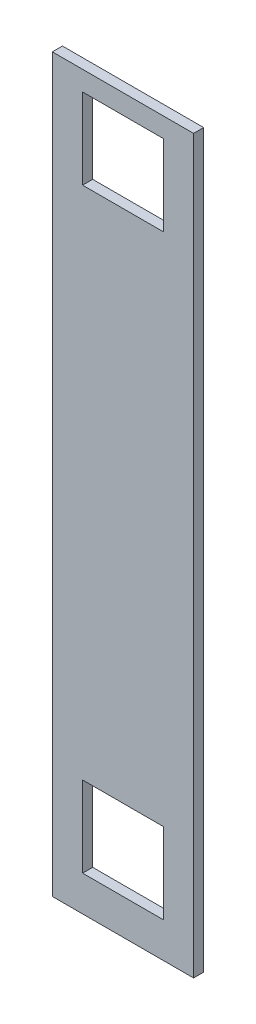
ISO-10303-21;
HEADER;
FILE_DESCRIPTION(('STEP AP214'),'2;1');
FILE_NAME('part.step','',(''),(''),'','','');
FILE_SCHEMA(('AUTOMOTIVE_DESIGN { 1 0 10303 214 1 1 1 1 }'));
ENDSEC;
DATA;
#1=APPLICATION_CONTEXT('core data for automotive mechanical design processes');
#2=APPLICATION_PROTOCOL_DEFINITION('international standard','automotive_design',2000,#1);
#3=PRODUCT_CONTEXT('',#1,'mechanical');
#4=PRODUCT('Part','Part','',(#3));
#5=PRODUCT_RELATED_PRODUCT_CATEGORY('part','',(#4));
#6=PRODUCT_DEFINITION_FORMATION('','',#4);
#7=PRODUCT_DEFINITION_CONTEXT('part definition',#1,'design');
#8=PRODUCT_DEFINITION('design','',#6,#7);
#9=PRODUCT_DEFINITION_SHAPE('','',#8);
#10=(LENGTH_UNIT() NAMED_UNIT(*) SI_UNIT(.MILLI.,.METRE.));
#11=(NAMED_UNIT(*) PLANE_ANGLE_UNIT() SI_UNIT($,.RADIAN.));
#12=(NAMED_UNIT(*) SI_UNIT($,.STERADIAN.) SOLID_ANGLE_UNIT());
#13=UNCERTAINTY_MEASURE_WITH_UNIT(LENGTH_MEASURE(1.E-05),#10,'distance_accuracy_value','');
#14=(GEOMETRIC_REPRESENTATION_CONTEXT(3) GLOBAL_UNCERTAINTY_ASSIGNED_CONTEXT((#13)) GLOBAL_UNIT_ASSIGNED_CONTEXT((#10,
#11,#12)) REPRESENTATION_CONTEXT('',''));
#15=CARTESIAN_POINT('',(0.,0.,0.));
#16=DIRECTION('',(0.,0.,1.));
#17=DIRECTION('',(1.,0.,0.));
#18=AXIS2_PLACEMENT_3D('',#15,#16,#17);
#19=CARTESIAN_POINT('',(88.9,-460.375,12.7));
#20=DIRECTION('',(-1.,0.,0.));
#21=DIRECTION('',(0.,0.,1.));
#22=AXIS2_PLACEMENT_3D('',#19,#20,#21);
#23=PLANE('',#22);
#24=DIRECTION('',(0.,1.,0.));
#25=VECTOR('',#24,1.);
#26=CARTESIAN_POINT('',(88.9,-460.375,0.));
#27=LINE('',#26,#25);
#28=CARTESIAN_POINT('',(88.9,-460.375,0.));
#29=VERTEX_POINT('',#28);
#30=CARTESIAN_POINT('',(88.9,460.375,0.));
#31=VERTEX_POINT('',#30);
#32=EDGE_CURVE('E142',#29,#31,#27,.T.);
#33=ORIENTED_EDGE('',*,*,#32,.T.);
#34=DIRECTION('',(0.,0.,-1.));
#35=VECTOR('',#34,1.);
#36=CARTESIAN_POINT('',(88.9,460.375,12.7));
#37=LINE('',#36,#35);
#38=CARTESIAN_POINT('',(88.9,460.375,12.7));
#39=VERTEX_POINT('',#38);
#40=EDGE_CURVE('E11',#39,#31,#37,.T.);
#41=ORIENTED_EDGE('',*,*,#40,.F.);
#42=DIRECTION('',(0.,1.,0.));
#43=VECTOR('',#42,1.);
#44=CARTESIAN_POINT('',(88.9,-460.375,12.7));
#45=LINE('',#44,#43);
#46=CARTESIAN_POINT('',(88.9,-460.375,12.7));
#47=VERTEX_POINT('',#46);
#48=EDGE_CURVE('E195',#47,#39,#45,.T.);
#49=ORIENTED_EDGE('',*,*,#48,.F.);
#50=DIRECTION('',(0.,0.,-1.));
#51=VECTOR('',#50,1.);
#52=CARTESIAN_POINT('',(88.9,-460.375,12.7));
#53=LINE('',#52,#51);
#54=EDGE_CURVE('E205',#47,#29,#53,.T.);
#55=ORIENTED_EDGE('',*,*,#54,.T.);
#56=EDGE_LOOP('',(#33,#41,#49,#55));
#57=FACE_BOUND('',#56,.T.);
#58=ADVANCED_FACE('F36',(#57),#23,.F.);
#59=CARTESIAN_POINT('',(-88.9,460.375,12.7));
#60=DIRECTION('',(0.,-1.,0.));
#61=DIRECTION('',(0.,0.,-1.));
#62=AXIS2_PLACEMENT_3D('',#59,#60,#61);
#63=PLANE('',#62);
#64=DIRECTION('',(-1.,0.,0.));
#65=VECTOR('',#64,1.);
#66=CARTESIAN_POINT('',(-88.9,460.375,0.));
#67=LINE('',#66,#65);
#68=CARTESIAN_POINT('',(-88.9,460.375,0.));
#69=VERTEX_POINT('',#68);
#70=EDGE_CURVE('E208',#31,#69,#67,.T.);
#71=ORIENTED_EDGE('',*,*,#70,.T.);
#72=DIRECTION('',(0.,0.,-1.));
#73=VECTOR('',#72,1.);
#74=CARTESIAN_POINT('',(-88.9,460.375,12.7));
#75=LINE('',#74,#73);
#76=CARTESIAN_POINT('',(-88.9,460.375,12.7));
#77=VERTEX_POINT('',#76);
#78=EDGE_CURVE('E43',#77,#69,#75,.T.);
#79=ORIENTED_EDGE('',*,*,#78,.F.);
#80=DIRECTION('',(-1.,0.,0.));
#81=VECTOR('',#80,1.);
#82=CARTESIAN_POINT('',(-88.9,460.375,12.7));
#83=LINE('',#82,#81);
#84=EDGE_CURVE('E198',#39,#77,#83,.T.);
#85=ORIENTED_EDGE('',*,*,#84,.F.);
#86=ORIENTED_EDGE('',*,*,#40,.T.);
#87=EDGE_LOOP('',(#71,#79,#85,#86));
#88=FACE_BOUND('',#87,.T.);
#89=ADVANCED_FACE('F237',(#88),#63,.F.);
#90=CARTESIAN_POINT('',(-88.9,-460.375,12.7));
#91=DIRECTION('',(1.,0.,0.));
#92=DIRECTION('',(0.,0.,-1.));
#93=AXIS2_PLACEMENT_3D('',#90,#91,#92);
#94=PLANE('',#93);
#95=DIRECTION('',(0.,-1.,0.));
#96=VECTOR('',#95,1.);
#97=CARTESIAN_POINT('',(-88.9,-460.375,0.));
#98=LINE('',#97,#96);
#99=CARTESIAN_POINT('',(-88.9,-460.375,0.));
#100=VERTEX_POINT('',#99);
#101=EDGE_CURVE('E210',#69,#100,#98,.T.);
#102=ORIENTED_EDGE('',*,*,#101,.T.);
#103=DIRECTION('',(0.,0.,-1.));
#104=VECTOR('',#103,1.);
#105=CARTESIAN_POINT('',(-88.9,-460.375,12.7));
#106=LINE('',#105,#104);
#107=CARTESIAN_POINT('',(-88.9,-460.375,12.7));
#108=VERTEX_POINT('',#107);
#109=EDGE_CURVE('E215',#108,#100,#106,.T.);
#110=ORIENTED_EDGE('',*,*,#109,.F.);
#111=DIRECTION('',(0.,-1.,0.));
#112=VECTOR('',#111,1.);
#113=CARTESIAN_POINT('',(-88.9,-460.375,12.7));
#114=LINE('',#113,#112);
#115=EDGE_CURVE('E201',#77,#108,#114,.T.);
#116=ORIENTED_EDGE('',*,*,#115,.F.);
#117=ORIENTED_EDGE('',*,*,#78,.T.);
#118=EDGE_LOOP('',(#102,#110,#116,#117));
#119=FACE_BOUND('',#118,.T.);
#120=ADVANCED_FACE('F222',(#119),#94,.F.);
#121=CARTESIAN_POINT('',(-88.9,-460.375,12.7));
#122=DIRECTION('',(0.,1.,0.));
#123=DIRECTION('',(0.,0.,1.));
#124=AXIS2_PLACEMENT_3D('',#121,#122,#123);
#125=PLANE('',#124);
#126=DIRECTION('',(1.,0.,0.));
#127=VECTOR('',#126,1.);
#128=CARTESIAN_POINT('',(-88.9,-460.375,0.));
#129=LINE('',#128,#127);
#130=EDGE_CURVE('E199',#100,#29,#129,.T.);
#131=ORIENTED_EDGE('',*,*,#130,.T.);
#132=ORIENTED_EDGE('',*,*,#54,.F.);
#133=DIRECTION('',(1.,0.,0.));
#134=VECTOR('',#133,1.);
#135=CARTESIAN_POINT('',(-88.9,-460.375,12.7));
#136=LINE('',#135,#134);
#137=EDGE_CURVE('E203',#108,#47,#136,.T.);
#138=ORIENTED_EDGE('',*,*,#137,.F.);
#139=ORIENTED_EDGE('',*,*,#109,.T.);
#140=EDGE_LOOP('',(#131,#132,#138,#139));
#141=FACE_BOUND('',#140,.T.);
#142=ADVANCED_FACE('F231',(#141),#125,.F.);
#143=CARTESIAN_POINT('',(0.,0.,12.7));
#144=DIRECTION('',(0.,0.,-1.));
#145=DIRECTION('',(-1.,0.,0.));
#146=AXIS2_PLACEMENT_3D('',#143,#144,#145);
#147=PLANE('',#146);
#148=DIRECTION('',(-1.,0.,0.));
#149=VECTOR('',#148,1.);
#150=CARTESIAN_POINT('',(50.8,-314.325,12.7));
#151=LINE('',#150,#149);
#152=CARTESIAN_POINT('',(50.8,-314.325,12.7));
#153=VERTEX_POINT('',#152);
#154=CARTESIAN_POINT('',(-50.8,-314.325,12.7));
#155=VERTEX_POINT('',#154);
#156=EDGE_CURVE('E148',#153,#155,#151,.T.);
#157=ORIENTED_EDGE('',*,*,#156,.F.);
#158=DIRECTION('',(0.,1.,0.));
#159=VECTOR('',#158,1.);
#160=CARTESIAN_POINT('',(50.8,-314.325,12.7));
#161=LINE('',#160,#159);
#162=CARTESIAN_POINT('',(50.8,-415.925,12.7));
#163=VERTEX_POINT('',#162);
#164=EDGE_CURVE('E128',#163,#153,#161,.T.);
#165=ORIENTED_EDGE('',*,*,#164,.F.);
#166=DIRECTION('',(1.,0.,0.));
#167=VECTOR('',#166,1.);
#168=CARTESIAN_POINT('',(50.8,-415.925,12.7));
#169=LINE('',#168,#167);
#170=CARTESIAN_POINT('',(-50.8,-415.925,12.7));
#171=VERTEX_POINT('',#170);
#172=EDGE_CURVE('E139',#171,#163,#169,.T.);
#173=ORIENTED_EDGE('',*,*,#172,.F.);
#174=DIRECTION('',(0.,-1.,0.));
#175=VECTOR('',#174,1.);
#176=CARTESIAN_POINT('',(-50.8,-314.325,12.7));
#177=LINE('',#176,#175);
#178=EDGE_CURVE('E50',#155,#171,#177,.T.);
#179=ORIENTED_EDGE('',*,*,#178,.F.);
#180=EDGE_LOOP('',(#157,#165,#173,#179));
#181=FACE_BOUND('',#180,.T.);
#182=DIRECTION('',(0.,-1.,0.));
#183=VECTOR('',#182,1.);
#184=CARTESIAN_POINT('',(-50.8,435.675,12.7));
#185=LINE('',#184,#183);
#186=CARTESIAN_POINT('',(-50.8,435.675,12.7));
#187=VERTEX_POINT('',#186);
#188=CARTESIAN_POINT('',(-50.8,334.075,12.7));
#189=VERTEX_POINT('',#188);
#190=EDGE_CURVE('E166',#187,#189,#185,.T.);
#191=ORIENTED_EDGE('',*,*,#190,.F.);
#192=DIRECTION('',(-1.,0.,0.));
#193=VECTOR('',#192,1.);
#194=CARTESIAN_POINT('',(50.8,435.675,12.7));
#195=LINE('',#194,#193);
#196=CARTESIAN_POINT('',(50.8,435.675,12.7));
#197=VERTEX_POINT('',#196);
#198=EDGE_CURVE('E169',#197,#187,#195,.T.);
#199=ORIENTED_EDGE('',*,*,#198,.F.);
#200=DIRECTION('',(0.,1.,0.));
#201=VECTOR('',#200,1.);
#202=CARTESIAN_POINT('',(50.8,435.675,12.7));
#203=LINE('',#202,#201);
#204=CARTESIAN_POINT('',(50.8,334.075,12.7));
#205=VERTEX_POINT('',#204);
#206=EDGE_CURVE('E186',#205,#197,#203,.T.);
#207=ORIENTED_EDGE('',*,*,#206,.F.);
#208=DIRECTION('',(1.,0.,0.));
#209=VECTOR('',#208,1.);
#210=CARTESIAN_POINT('',(50.8,334.075,12.7));
#211=LINE('',#210,#209);
#212=EDGE_CURVE('E58',#189,#205,#211,.T.);
#213=ORIENTED_EDGE('',*,*,#212,.F.);
#214=EDGE_LOOP('',(#191,#199,#207,#213));
#215=FACE_BOUND('',#214,.T.);
#216=ORIENTED_EDGE('',*,*,#48,.T.);
#217=ORIENTED_EDGE('',*,*,#84,.T.);
#218=ORIENTED_EDGE('',*,*,#115,.T.);
#219=ORIENTED_EDGE('',*,*,#137,.T.);
#220=EDGE_LOOP('',(#216,#217,#218,#219));
#221=FACE_BOUND('',#220,.T.);
#222=ADVANCED_FACE('F145',(#181,#215,#221),#147,.F.);
#223=CARTESIAN_POINT('',(0.,0.,0.));
#224=DIRECTION('',(0.,0.,-1.));
#225=DIRECTION('',(-1.,0.,0.));
#226=AXIS2_PLACEMENT_3D('',#223,#224,#225);
#227=PLANE('',#226);
#228=DIRECTION('',(0.,-1.,0.));
#229=VECTOR('',#228,1.);
#230=CARTESIAN_POINT('',(50.8,-314.325,0.));
#231=LINE('',#230,#229);
#232=CARTESIAN_POINT('',(50.8,-314.325,0.));
#233=VERTEX_POINT('',#232);
#234=CARTESIAN_POINT('',(50.8,-415.925,0.));
#235=VERTEX_POINT('',#234);
#236=EDGE_CURVE('E131',#233,#235,#231,.T.);
#237=ORIENTED_EDGE('',*,*,#236,.F.);
#238=DIRECTION('',(1.,0.,0.));
#239=VECTOR('',#238,1.);
#240=CARTESIAN_POINT('',(50.8,-314.325,0.));
#241=LINE('',#240,#239);
#242=CARTESIAN_POINT('',(-50.8,-314.325,0.));
#243=VERTEX_POINT('',#242);
#244=EDGE_CURVE('E136',#243,#233,#241,.T.);
#245=ORIENTED_EDGE('',*,*,#244,.F.);
#246=DIRECTION('',(0.,1.,0.));
#247=VECTOR('',#246,1.);
#248=CARTESIAN_POINT('',(-50.8,-314.325,0.));
#249=LINE('',#248,#247);
#250=CARTESIAN_POINT('',(-50.8,-415.925,0.));
#251=VERTEX_POINT('',#250);
#252=EDGE_CURVE('E156',#251,#243,#249,.T.);
#253=ORIENTED_EDGE('',*,*,#252,.F.);
#254=DIRECTION('',(-1.,0.,0.));
#255=VECTOR('',#254,1.);
#256=CARTESIAN_POINT('',(50.8,-415.925,0.));
#257=LINE('',#256,#255);
#258=EDGE_CURVE('E150',#235,#251,#257,.T.);
#259=ORIENTED_EDGE('',*,*,#258,.F.);
#260=EDGE_LOOP('',(#237,#245,#253,#259));
#261=FACE_BOUND('',#260,.T.);
#262=DIRECTION('',(1.,0.,0.));
#263=VECTOR('',#262,1.);
#264=CARTESIAN_POINT('',(50.8,435.675,0.));
#265=LINE('',#264,#263);
#266=CARTESIAN_POINT('',(-50.8,435.675,0.));
#267=VERTEX_POINT('',#266);
#268=CARTESIAN_POINT('',(50.8,435.675,0.));
#269=VERTEX_POINT('',#268);
#270=EDGE_CURVE('E172',#267,#269,#265,.T.);
#271=ORIENTED_EDGE('',*,*,#270,.F.);
#272=DIRECTION('',(0.,1.,0.));
#273=VECTOR('',#272,1.);
#274=CARTESIAN_POINT('',(-50.8,435.675,0.));
#275=LINE('',#274,#273);
#276=CARTESIAN_POINT('',(-50.8,334.075,0.));
#277=VERTEX_POINT('',#276);
#278=EDGE_CURVE('E180',#277,#267,#275,.T.);
#279=ORIENTED_EDGE('',*,*,#278,.F.);
#280=DIRECTION('',(-1.,0.,0.));
#281=VECTOR('',#280,1.);
#282=CARTESIAN_POINT('',(50.8,334.075,0.));
#283=LINE('',#282,#281);
#284=CARTESIAN_POINT('',(50.8,334.075,0.));
#285=VERTEX_POINT('',#284);
#286=EDGE_CURVE('E177',#285,#277,#283,.T.);
#287=ORIENTED_EDGE('',*,*,#286,.F.);
#288=DIRECTION('',(0.,-1.,0.));
#289=VECTOR('',#288,1.);
#290=CARTESIAN_POINT('',(50.8,435.675,0.));
#291=LINE('',#290,#289);
#292=EDGE_CURVE('E174',#269,#285,#291,.T.);
#293=ORIENTED_EDGE('',*,*,#292,.F.);
#294=EDGE_LOOP('',(#271,#279,#287,#293));
#295=FACE_BOUND('',#294,.T.);
#296=ORIENTED_EDGE('',*,*,#32,.F.);
#297=ORIENTED_EDGE('',*,*,#130,.F.);
#298=ORIENTED_EDGE('',*,*,#101,.F.);
#299=ORIENTED_EDGE('',*,*,#70,.F.);
#300=EDGE_LOOP('',(#296,#297,#298,#299));
#301=FACE_BOUND('',#300,.T.);
#302=ADVANCED_FACE('F228',(#261,#295,#301),#227,.T.);
#303=CARTESIAN_POINT('',(50.8,435.675,12.701));
#304=DIRECTION('',(0.,1.,0.));
#305=DIRECTION('',(0.,0.,1.));
#306=AXIS2_PLACEMENT_3D('',#303,#304,#305);
#307=PLANE('',#306);
#308=ORIENTED_EDGE('',*,*,#198,.T.);
#309=DIRECTION('',(0.,0.,-1.));
#310=VECTOR('',#309,1.);
#311=CARTESIAN_POINT('',(-50.8,435.675,12.701));
#312=LINE('',#311,#310);
#313=EDGE_CURVE('E184',#187,#267,#312,.T.);
#314=ORIENTED_EDGE('',*,*,#313,.T.);
#315=ORIENTED_EDGE('',*,*,#270,.T.);
#316=DIRECTION('',(0.,0.,-1.));
#317=VECTOR('',#316,1.);
#318=CARTESIAN_POINT('',(50.8,435.675,12.701));
#319=LINE('',#318,#317);
#320=EDGE_CURVE('E183',#197,#269,#319,.T.);
#321=ORIENTED_EDGE('',*,*,#320,.F.);
#322=EDGE_LOOP('',(#308,#314,#315,#321));
#323=FACE_BOUND('',#322,.T.);
#324=ADVANCED_FACE('F249',(#323),#307,.F.);
#325=CARTESIAN_POINT('',(-50.8,435.675,12.701));
#326=DIRECTION('',(-1.,0.,0.));
#327=DIRECTION('',(0.,0.,1.));
#328=AXIS2_PLACEMENT_3D('',#325,#326,#327);
#329=PLANE('',#328);
#330=ORIENTED_EDGE('',*,*,#190,.T.);
#331=DIRECTION('',(0.,0.,-1.));
#332=VECTOR('',#331,1.);
#333=CARTESIAN_POINT('',(-50.8,334.075,12.701));
#334=LINE('',#333,#332);
#335=EDGE_CURVE('E187',#189,#277,#334,.T.);
#336=ORIENTED_EDGE('',*,*,#335,.T.);
#337=ORIENTED_EDGE('',*,*,#278,.T.);
#338=ORIENTED_EDGE('',*,*,#313,.F.);
#339=EDGE_LOOP('',(#330,#336,#337,#338));
#340=FACE_BOUND('',#339,.T.);
#341=ADVANCED_FACE('F255',(#340),#329,.F.);
#342=CARTESIAN_POINT('',(50.8,334.075,12.701));
#343=DIRECTION('',(0.,-1.,0.));
#344=DIRECTION('',(0.,0.,-1.));
#345=AXIS2_PLACEMENT_3D('',#342,#343,#344);
#346=PLANE('',#345);
#347=ORIENTED_EDGE('',*,*,#212,.T.);
#348=DIRECTION('',(0.,0.,-1.));
#349=VECTOR('',#348,1.);
#350=CARTESIAN_POINT('',(50.8,334.075,12.701));
#351=LINE('',#350,#349);
#352=EDGE_CURVE('E189',#205,#285,#351,.T.);
#353=ORIENTED_EDGE('',*,*,#352,.T.);
#354=ORIENTED_EDGE('',*,*,#286,.T.);
#355=ORIENTED_EDGE('',*,*,#335,.F.);
#356=EDGE_LOOP('',(#347,#353,#354,#355));
#357=FACE_BOUND('',#356,.T.);
#358=ADVANCED_FACE('F260',(#357),#346,.F.);
#359=CARTESIAN_POINT('',(50.8,435.675,12.701));
#360=DIRECTION('',(1.,0.,0.));
#361=DIRECTION('',(0.,0.,-1.));
#362=AXIS2_PLACEMENT_3D('',#359,#360,#361);
#363=PLANE('',#362);
#364=ORIENTED_EDGE('',*,*,#206,.T.);
#365=ORIENTED_EDGE('',*,*,#320,.T.);
#366=ORIENTED_EDGE('',*,*,#292,.T.);
#367=ORIENTED_EDGE('',*,*,#352,.F.);
#368=EDGE_LOOP('',(#364,#365,#366,#367));
#369=FACE_BOUND('',#368,.T.);
#370=ADVANCED_FACE('F257',(#369),#363,.F.);
#371=CARTESIAN_POINT('',(50.8,-314.325,12.701));
#372=DIRECTION('',(1.,0.,0.));
#373=DIRECTION('',(0.,0.,-1.));
#374=AXIS2_PLACEMENT_3D('',#371,#372,#373);
#375=PLANE('',#374);
#376=ORIENTED_EDGE('',*,*,#164,.T.);
#377=DIRECTION('',(0.,0.,-1.));
#378=VECTOR('',#377,1.);
#379=CARTESIAN_POINT('',(50.8,-314.325,12.701));
#380=LINE('',#379,#378);
#381=EDGE_CURVE('E143',#153,#233,#380,.T.);
#382=ORIENTED_EDGE('',*,*,#381,.T.);
#383=ORIENTED_EDGE('',*,*,#236,.T.);
#384=DIRECTION('',(0.,0.,-1.));
#385=VECTOR('',#384,1.);
#386=CARTESIAN_POINT('',(50.8,-415.925,12.701));
#387=LINE('',#386,#385);
#388=EDGE_CURVE('E124',#163,#235,#387,.T.);
#389=ORIENTED_EDGE('',*,*,#388,.F.);
#390=EDGE_LOOP('',(#376,#382,#383,#389));
#391=FACE_BOUND('',#390,.T.);
#392=ADVANCED_FACE('F126',(#391),#375,.F.);
#393=CARTESIAN_POINT('',(50.8,-314.325,12.701));
#394=DIRECTION('',(0.,1.,0.));
#395=DIRECTION('',(0.,0.,1.));
#396=AXIS2_PLACEMENT_3D('',#393,#394,#395);
#397=PLANE('',#396);
#398=ORIENTED_EDGE('',*,*,#156,.T.);
#399=DIRECTION('',(0.,0.,-1.));
#400=VECTOR('',#399,1.);
#401=CARTESIAN_POINT('',(-50.8,-314.325,12.701));
#402=LINE('',#401,#400);
#403=EDGE_CURVE('E162',#155,#243,#402,.T.);
#404=ORIENTED_EDGE('',*,*,#403,.T.);
#405=ORIENTED_EDGE('',*,*,#244,.T.);
#406=ORIENTED_EDGE('',*,*,#381,.F.);
#407=EDGE_LOOP('',(#398,#404,#405,#406));
#408=FACE_BOUND('',#407,.T.);
#409=ADVANCED_FACE('F269',(#408),#397,.F.);
#410=CARTESIAN_POINT('',(-50.8,-314.325,12.701));
#411=DIRECTION('',(-1.,0.,0.));
#412=DIRECTION('',(0.,0.,1.));
#413=AXIS2_PLACEMENT_3D('',#410,#411,#412);
#414=PLANE('',#413);
#415=ORIENTED_EDGE('',*,*,#178,.T.);
#416=DIRECTION('',(0.,0.,-1.));
#417=VECTOR('',#416,1.);
#418=CARTESIAN_POINT('',(-50.8,-415.925,12.701));
#419=LINE('',#418,#417);
#420=EDGE_CURVE('E135',#171,#251,#419,.T.);
#421=ORIENTED_EDGE('',*,*,#420,.T.);
#422=ORIENTED_EDGE('',*,*,#252,.T.);
#423=ORIENTED_EDGE('',*,*,#403,.F.);
#424=EDGE_LOOP('',(#415,#421,#422,#423));
#425=FACE_BOUND('',#424,.T.);
#426=ADVANCED_FACE('F272',(#425),#414,.F.);
#427=CARTESIAN_POINT('',(50.8,-415.925,12.701));
#428=DIRECTION('',(0.,-1.,0.));
#429=DIRECTION('',(0.,0.,-1.));
#430=AXIS2_PLACEMENT_3D('',#427,#428,#429);
#431=PLANE('',#430);
#432=ORIENTED_EDGE('',*,*,#172,.T.);
#433=ORIENTED_EDGE('',*,*,#388,.T.);
#434=ORIENTED_EDGE('',*,*,#258,.T.);
#435=ORIENTED_EDGE('',*,*,#420,.F.);
#436=EDGE_LOOP('',(#432,#433,#434,#435));
#437=FACE_BOUND('',#436,.T.);
#438=ADVANCED_FACE('F140',(#437),#431,.F.);
#439=CLOSED_SHELL('',(#58,#89,#120,#142,#222,#302,#324,#341,#358,#370,#392,#409,#426,#438));
#440=MANIFOLD_SOLID_BREP('B2',#439);
#441=ADVANCED_BREP_SHAPE_REPRESENTATION('',(#18,#440),#14);
#442=SHAPE_DEFINITION_REPRESENTATION(#9,#441);
ENDSEC;
END-ISO-10303-21;
